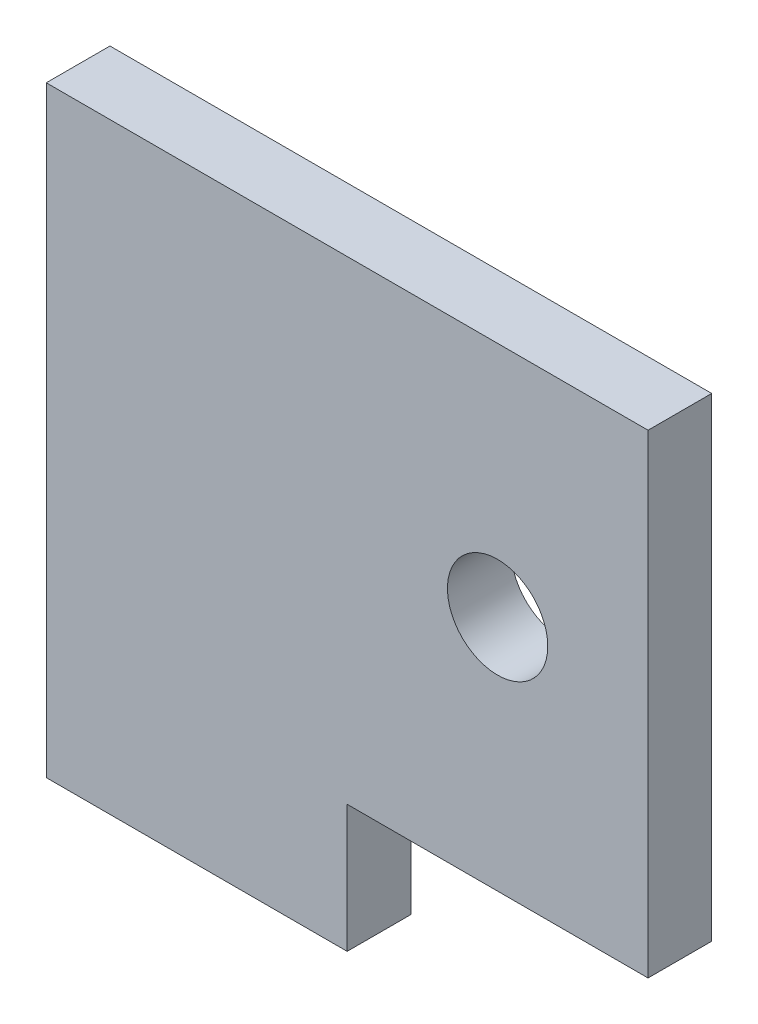
ISO-10303-21;
HEADER;
FILE_DESCRIPTION(('STEP AP214'),'2;1');
FILE_NAME('part.step','',(''),(''),'','','');
FILE_SCHEMA(('AUTOMOTIVE_DESIGN { 1 0 10303 214 1 1 1 1 }'));
ENDSEC;
DATA;
#1=APPLICATION_CONTEXT('core data for automotive mechanical design processes');
#2=APPLICATION_PROTOCOL_DEFINITION('international standard','automotive_design',2000,#1);
#3=PRODUCT_CONTEXT('',#1,'mechanical');
#4=PRODUCT('Part','Part','',(#3));
#5=PRODUCT_RELATED_PRODUCT_CATEGORY('part','',(#4));
#6=PRODUCT_DEFINITION_FORMATION('','',#4);
#7=PRODUCT_DEFINITION_CONTEXT('part definition',#1,'design');
#8=PRODUCT_DEFINITION('design','',#6,#7);
#9=PRODUCT_DEFINITION_SHAPE('','',#8);
#10=(LENGTH_UNIT() NAMED_UNIT(*) SI_UNIT(.MILLI.,.METRE.));
#11=(NAMED_UNIT(*) PLANE_ANGLE_UNIT() SI_UNIT($,.RADIAN.));
#12=(NAMED_UNIT(*) SI_UNIT($,.STERADIAN.) SOLID_ANGLE_UNIT());
#13=UNCERTAINTY_MEASURE_WITH_UNIT(LENGTH_MEASURE(1.E-05),#10,'distance_accuracy_value','');
#14=(GEOMETRIC_REPRESENTATION_CONTEXT(3) GLOBAL_UNCERTAINTY_ASSIGNED_CONTEXT((#13)) GLOBAL_UNIT_ASSIGNED_CONTEXT((#10,
#11,#12)) REPRESENTATION_CONTEXT('',''));
#15=CARTESIAN_POINT('',(0.,0.,0.));
#16=DIRECTION('',(0.,0.,1.));
#17=DIRECTION('',(1.,0.,0.));
#18=AXIS2_PLACEMENT_3D('',#15,#16,#17);
#19=CARTESIAN_POINT('',(0.,0.,3.175));
#20=DIRECTION('',(0.,0.,-1.));
#21=DIRECTION('',(-1.,0.,0.));
#22=AXIS2_PLACEMENT_3D('',#19,#20,#21);
#23=PLANE('',#22);
#24=DIRECTION('',(0.,-1.,0.));
#25=VECTOR('',#24,1.);
#26=CARTESIAN_POINT('',(0.,0.,3.175));
#27=LINE('',#26,#25);
#28=CARTESIAN_POINT('',(0.,30.,3.175));
#29=VERTEX_POINT('',#28);
#30=CARTESIAN_POINT('',(0.,0.,3.175));
#31=VERTEX_POINT('',#30);
#32=EDGE_CURVE('E129',#29,#31,#27,.T.);
#33=ORIENTED_EDGE('',*,*,#32,.T.);
#34=DIRECTION('',(1.,0.,0.));
#35=VECTOR('',#34,1.);
#36=CARTESIAN_POINT('',(0.,0.,3.175));
#37=LINE('',#36,#35);
#38=CARTESIAN_POINT('',(15.,0.,3.175));
#39=VERTEX_POINT('',#38);
#40=EDGE_CURVE('E87',#31,#39,#37,.T.);
#41=ORIENTED_EDGE('',*,*,#40,.T.);
#42=DIRECTION('',(0.,1.,0.));
#43=VECTOR('',#42,1.);
#44=CARTESIAN_POINT('',(15.,0.,3.175));
#45=LINE('',#44,#43);
#46=CARTESIAN_POINT('',(15.,6.35,3.175));
#47=VERTEX_POINT('',#46);
#48=EDGE_CURVE('E100',#39,#47,#45,.T.);
#49=ORIENTED_EDGE('',*,*,#48,.T.);
#50=DIRECTION('',(1.,0.,0.));
#51=VECTOR('',#50,1.);
#52=CARTESIAN_POINT('',(15.,6.35,3.175));
#53=LINE('',#52,#51);
#54=CARTESIAN_POINT('',(30.,6.35,3.175));
#55=VERTEX_POINT('',#54);
#56=EDGE_CURVE('E94',#47,#55,#53,.T.);
#57=ORIENTED_EDGE('',*,*,#56,.T.);
#58=DIRECTION('',(0.,1.,0.));
#59=VECTOR('',#58,1.);
#60=CARTESIAN_POINT('',(30.,6.35,3.175));
#61=LINE('',#60,#59);
#62=CARTESIAN_POINT('',(30.,30.,3.175));
#63=VERTEX_POINT('',#62);
#64=EDGE_CURVE('E98',#55,#63,#61,.T.);
#65=ORIENTED_EDGE('',*,*,#64,.T.);
#66=DIRECTION('',(-1.,0.,0.));
#67=VECTOR('',#66,1.);
#68=CARTESIAN_POINT('',(0.,30.,3.175));
#69=LINE('',#68,#67);
#70=EDGE_CURVE('E50',#63,#29,#69,.T.);
#71=ORIENTED_EDGE('',*,*,#70,.T.);
#72=EDGE_LOOP('',(#33,#41,#49,#57,#65,#71));
#73=FACE_BOUND('',#72,.T.);
#74=CARTESIAN_POINT('',(22.5,18.175,3.175));
#75=DIRECTION('',(0.,0.,1.));
#76=DIRECTION('',(1.,0.,0.));
#77=AXIS2_PLACEMENT_3D('',#74,#75,#76);
#78=CIRCLE('',#77,2.5);
#79=CARTESIAN_POINT('',(25.,18.175,3.175));
#80=VERTEX_POINT('',#79);
#81=EDGE_CURVE('E122',#80,#80,#78,.T.);
#82=ORIENTED_EDGE('',*,*,#81,.F.);
#83=EDGE_LOOP('',(#82));
#84=FACE_BOUND('',#83,.T.);
#85=ADVANCED_FACE('F33',(#73,#84),#23,.F.);
#86=CARTESIAN_POINT('',(0.,0.,0.));
#87=DIRECTION('',(0.,0.,-1.));
#88=DIRECTION('',(-1.,0.,0.));
#89=AXIS2_PLACEMENT_3D('',#86,#87,#88);
#90=PLANE('',#89);
#91=DIRECTION('',(0.,-1.,0.));
#92=VECTOR('',#91,1.);
#93=CARTESIAN_POINT('',(0.,0.,0.));
#94=LINE('',#93,#92);
#95=CARTESIAN_POINT('',(0.,30.,0.));
#96=VERTEX_POINT('',#95);
#97=CARTESIAN_POINT('',(0.,0.,0.));
#98=VERTEX_POINT('',#97);
#99=EDGE_CURVE('E118',#96,#98,#94,.T.);
#100=ORIENTED_EDGE('',*,*,#99,.F.);
#101=DIRECTION('',(-1.,0.,0.));
#102=VECTOR('',#101,1.);
#103=CARTESIAN_POINT('',(0.,30.,0.));
#104=LINE('',#103,#102);
#105=CARTESIAN_POINT('',(30.,30.,0.));
#106=VERTEX_POINT('',#105);
#107=EDGE_CURVE('E79',#106,#96,#104,.T.);
#108=ORIENTED_EDGE('',*,*,#107,.F.);
#109=DIRECTION('',(0.,1.,0.));
#110=VECTOR('',#109,1.);
#111=CARTESIAN_POINT('',(30.,6.35,0.));
#112=LINE('',#111,#110);
#113=CARTESIAN_POINT('',(30.,6.35,0.));
#114=VERTEX_POINT('',#113);
#115=EDGE_CURVE('E73',#114,#106,#112,.T.);
#116=ORIENTED_EDGE('',*,*,#115,.F.);
#117=DIRECTION('',(1.,0.,0.));
#118=VECTOR('',#117,1.);
#119=CARTESIAN_POINT('',(15.,6.35,0.));
#120=LINE('',#119,#118);
#121=CARTESIAN_POINT('',(15.,6.35,0.));
#122=VERTEX_POINT('',#121);
#123=EDGE_CURVE('E108',#122,#114,#120,.T.);
#124=ORIENTED_EDGE('',*,*,#123,.F.);
#125=DIRECTION('',(0.,1.,0.));
#126=VECTOR('',#125,1.);
#127=CARTESIAN_POINT('',(15.,0.,0.));
#128=LINE('',#127,#126);
#129=CARTESIAN_POINT('',(15.,0.,0.));
#130=VERTEX_POINT('',#129);
#131=EDGE_CURVE('E124',#130,#122,#128,.T.);
#132=ORIENTED_EDGE('',*,*,#131,.F.);
#133=DIRECTION('',(1.,0.,0.));
#134=VECTOR('',#133,1.);
#135=CARTESIAN_POINT('',(0.,0.,0.));
#136=LINE('',#135,#134);
#137=EDGE_CURVE('E121',#98,#130,#136,.T.);
#138=ORIENTED_EDGE('',*,*,#137,.F.);
#139=EDGE_LOOP('',(#100,#108,#116,#124,#132,#138));
#140=FACE_BOUND('',#139,.T.);
#141=CARTESIAN_POINT('',(22.5,18.175,0.));
#142=DIRECTION('',(0.,0.,1.));
#143=DIRECTION('',(1.,0.,0.));
#144=AXIS2_PLACEMENT_3D('',#141,#142,#143);
#145=CIRCLE('',#144,2.5);
#146=CARTESIAN_POINT('',(25.,18.175,0.));
#147=VERTEX_POINT('',#146);
#148=EDGE_CURVE('E222',#147,#147,#145,.T.);
#149=ORIENTED_EDGE('',*,*,#148,.T.);
#150=EDGE_LOOP('',(#149));
#151=FACE_BOUND('',#150,.T.);
#152=ADVANCED_FACE('F138',(#140,#151),#90,.T.);
#153=CARTESIAN_POINT('',(0.,0.,3.175));
#154=DIRECTION('',(1.,0.,0.));
#155=DIRECTION('',(0.,0.,-1.));
#156=AXIS2_PLACEMENT_3D('',#153,#154,#155);
#157=PLANE('',#156);
#158=ORIENTED_EDGE('',*,*,#99,.T.);
#159=DIRECTION('',(0.,0.,-1.));
#160=VECTOR('',#159,1.);
#161=CARTESIAN_POINT('',(0.,0.,3.175));
#162=LINE('',#161,#160);
#163=EDGE_CURVE('E11',#31,#98,#162,.T.);
#164=ORIENTED_EDGE('',*,*,#163,.F.);
#165=ORIENTED_EDGE('',*,*,#32,.F.);
#166=DIRECTION('',(0.,0.,-1.));
#167=VECTOR('',#166,1.);
#168=CARTESIAN_POINT('',(0.,30.,3.175));
#169=LINE('',#168,#167);
#170=EDGE_CURVE('E114',#29,#96,#169,.T.);
#171=ORIENTED_EDGE('',*,*,#170,.T.);
#172=EDGE_LOOP('',(#158,#164,#165,#171));
#173=FACE_BOUND('',#172,.T.);
#174=ADVANCED_FACE('F35',(#173),#157,.F.);
#175=CARTESIAN_POINT('',(0.,0.,3.175));
#176=DIRECTION('',(0.,1.,0.));
#177=DIRECTION('',(0.,0.,1.));
#178=AXIS2_PLACEMENT_3D('',#175,#176,#177);
#179=PLANE('',#178);
#180=ORIENTED_EDGE('',*,*,#137,.T.);
#181=DIRECTION('',(0.,0.,-1.));
#182=VECTOR('',#181,1.);
#183=CARTESIAN_POINT('',(15.,0.,3.175));
#184=LINE('',#183,#182);
#185=EDGE_CURVE('E42',#39,#130,#184,.T.);
#186=ORIENTED_EDGE('',*,*,#185,.F.);
#187=ORIENTED_EDGE('',*,*,#40,.F.);
#188=ORIENTED_EDGE('',*,*,#163,.T.);
#189=EDGE_LOOP('',(#180,#186,#187,#188));
#190=FACE_BOUND('',#189,.T.);
#191=ADVANCED_FACE('F163',(#190),#179,.F.);
#192=CARTESIAN_POINT('',(15.,0.,3.175));
#193=DIRECTION('',(-1.,0.,0.));
#194=DIRECTION('',(0.,0.,1.));
#195=AXIS2_PLACEMENT_3D('',#192,#193,#194);
#196=PLANE('',#195);
#197=ORIENTED_EDGE('',*,*,#131,.T.);
#198=DIRECTION('',(0.,0.,-1.));
#199=VECTOR('',#198,1.);
#200=CARTESIAN_POINT('',(15.,6.35,3.175));
#201=LINE('',#200,#199);
#202=EDGE_CURVE('E109',#47,#122,#201,.T.);
#203=ORIENTED_EDGE('',*,*,#202,.F.);
#204=ORIENTED_EDGE('',*,*,#48,.F.);
#205=ORIENTED_EDGE('',*,*,#185,.T.);
#206=EDGE_LOOP('',(#197,#203,#204,#205));
#207=FACE_BOUND('',#206,.T.);
#208=ADVANCED_FACE('F135',(#207),#196,.F.);
#209=CARTESIAN_POINT('',(15.,6.35,3.175));
#210=DIRECTION('',(0.,1.,0.));
#211=DIRECTION('',(0.,0.,1.));
#212=AXIS2_PLACEMENT_3D('',#209,#210,#211);
#213=PLANE('',#212);
#214=ORIENTED_EDGE('',*,*,#123,.T.);
#215=DIRECTION('',(0.,0.,-1.));
#216=VECTOR('',#215,1.);
#217=CARTESIAN_POINT('',(30.,6.35,3.175));
#218=LINE('',#217,#216);
#219=EDGE_CURVE('E105',#55,#114,#218,.T.);
#220=ORIENTED_EDGE('',*,*,#219,.F.);
#221=ORIENTED_EDGE('',*,*,#56,.F.);
#222=ORIENTED_EDGE('',*,*,#202,.T.);
#223=EDGE_LOOP('',(#214,#220,#221,#222));
#224=FACE_BOUND('',#223,.T.);
#225=ADVANCED_FACE('F106',(#224),#213,.F.);
#226=CARTESIAN_POINT('',(30.,6.35,3.175));
#227=DIRECTION('',(-1.,0.,0.));
#228=DIRECTION('',(0.,0.,1.));
#229=AXIS2_PLACEMENT_3D('',#226,#227,#228);
#230=PLANE('',#229);
#231=ORIENTED_EDGE('',*,*,#115,.T.);
#232=DIRECTION('',(0.,0.,-1.));
#233=VECTOR('',#232,1.);
#234=CARTESIAN_POINT('',(30.,30.,3.175));
#235=LINE('',#234,#233);
#236=EDGE_CURVE('E110',#63,#106,#235,.T.);
#237=ORIENTED_EDGE('',*,*,#236,.F.);
#238=ORIENTED_EDGE('',*,*,#64,.F.);
#239=ORIENTED_EDGE('',*,*,#219,.T.);
#240=EDGE_LOOP('',(#231,#237,#238,#239));
#241=FACE_BOUND('',#240,.T.);
#242=ADVANCED_FACE('F112',(#241),#230,.F.);
#243=CARTESIAN_POINT('',(0.,30.,3.175));
#244=DIRECTION('',(0.,-1.,0.));
#245=DIRECTION('',(0.,0.,-1.));
#246=AXIS2_PLACEMENT_3D('',#243,#244,#245);
#247=PLANE('',#246);
#248=ORIENTED_EDGE('',*,*,#107,.T.);
#249=ORIENTED_EDGE('',*,*,#170,.F.);
#250=ORIENTED_EDGE('',*,*,#70,.F.);
#251=ORIENTED_EDGE('',*,*,#236,.T.);
#252=EDGE_LOOP('',(#248,#249,#250,#251));
#253=FACE_BOUND('',#252,.T.);
#254=ADVANCED_FACE('F143',(#253),#247,.F.);
#255=CARTESIAN_POINT('',(22.5,18.175,3.175));
#256=DIRECTION('',(0.,0.,-1.));
#257=DIRECTION('',(-1.,0.,0.));
#258=AXIS2_PLACEMENT_3D('',#255,#256,#257);
#259=CYLINDRICAL_SURFACE('',#258,2.5);
#260=ORIENTED_EDGE('',*,*,#81,.T.);
#261=EDGE_LOOP('',(#260));
#262=FACE_BOUND('',#261,.T.);
#263=ORIENTED_EDGE('',*,*,#148,.F.);
#264=EDGE_LOOP('',(#263));
#265=FACE_BOUND('',#264,.T.);
#266=ADVANCED_FACE('F145',(#262,#265),#259,.F.);
#267=CLOSED_SHELL('',(#85,#152,#174,#191,#208,#225,#242,#254,#266));
#268=MANIFOLD_SOLID_BREP('B2',#267);
#269=ADVANCED_BREP_SHAPE_REPRESENTATION('',(#18,#268),#14);
#270=SHAPE_DEFINITION_REPRESENTATION(#9,#269);
ENDSEC;
END-ISO-10303-21;
